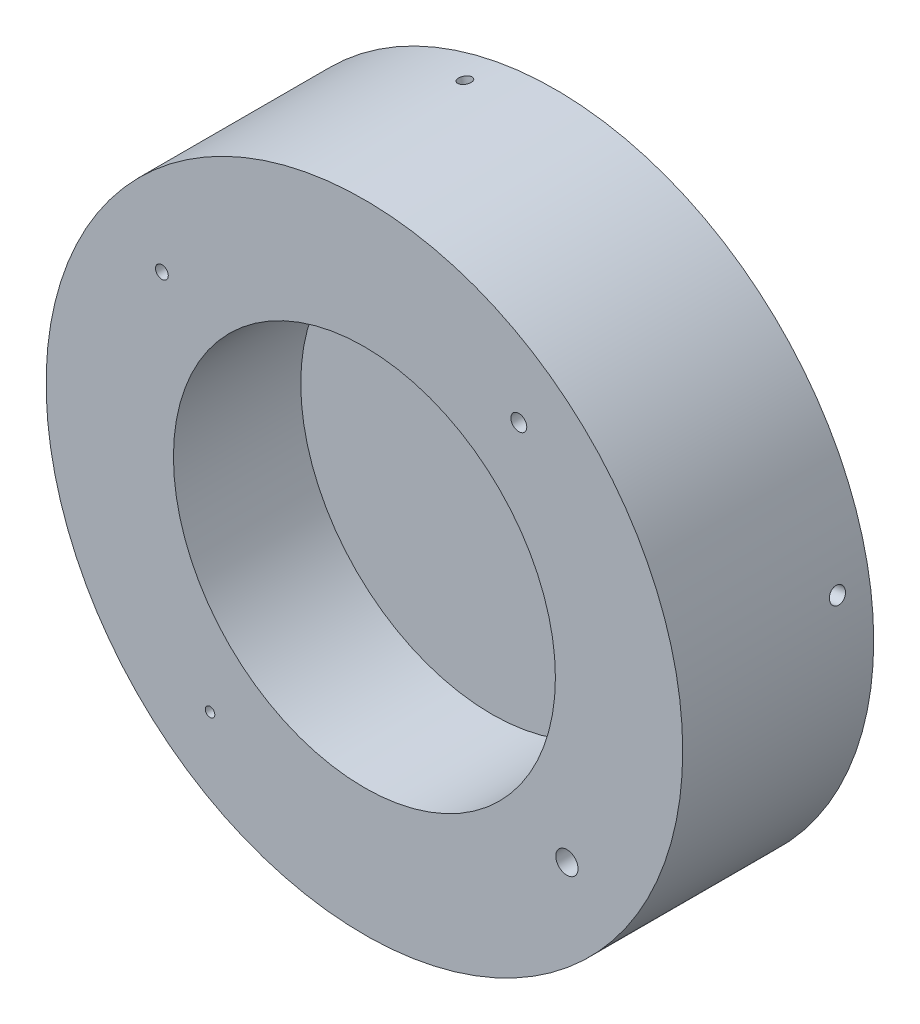
ISO-10303-21;
HEADER;
FILE_DESCRIPTION(('STEP AP214'),'2;1');
FILE_NAME('part.step','',(''),(''),'','','');
FILE_SCHEMA(('AUTOMOTIVE_DESIGN { 1 0 10303 214 1 1 1 1 }'));
ENDSEC;
DATA;
#1=APPLICATION_CONTEXT('core data for automotive mechanical design processes');
#2=APPLICATION_PROTOCOL_DEFINITION('international standard','automotive_design',2000,#1);
#3=PRODUCT_CONTEXT('',#1,'mechanical');
#4=PRODUCT('Part','Part','',(#3));
#5=PRODUCT_RELATED_PRODUCT_CATEGORY('part','',(#4));
#6=PRODUCT_DEFINITION_FORMATION('','',#4);
#7=PRODUCT_DEFINITION_CONTEXT('part definition',#1,'design');
#8=PRODUCT_DEFINITION('design','',#6,#7);
#9=PRODUCT_DEFINITION_SHAPE('','',#8);
#10=(LENGTH_UNIT() NAMED_UNIT(*) SI_UNIT(.MILLI.,.METRE.));
#11=(NAMED_UNIT(*) PLANE_ANGLE_UNIT() SI_UNIT($,.RADIAN.));
#12=(NAMED_UNIT(*) SI_UNIT($,.STERADIAN.) SOLID_ANGLE_UNIT());
#13=UNCERTAINTY_MEASURE_WITH_UNIT(LENGTH_MEASURE(1.E-05),#10,'distance_accuracy_value','');
#14=(GEOMETRIC_REPRESENTATION_CONTEXT(3) GLOBAL_UNCERTAINTY_ASSIGNED_CONTEXT((#13)) GLOBAL_UNIT_ASSIGNED_CONTEXT((#10,
#11,#12)) REPRESENTATION_CONTEXT('',''));
#15=CARTESIAN_POINT('',(0.,0.,0.));
#16=DIRECTION('',(0.,0.,1.));
#17=DIRECTION('',(1.,0.,0.));
#18=AXIS2_PLACEMENT_3D('',#15,#16,#17);
#19=CARTESIAN_POINT('',(0.,0.,30.));
#20=DIRECTION('',(0.,0.,-1.));
#21=DIRECTION('',(-1.,0.,0.));
#22=AXIS2_PLACEMENT_3D('',#19,#20,#21);
#23=CYLINDRICAL_SURFACE('',#22,50.);
#24=CARTESIAN_POINT('',(-48.800785067302,-10.8850069735848,4.99999999995523));
#25=CARTESIAN_POINT('',(-48.8007855208781,-10.8850051606418,4.95787471332662));
#26=CARTESIAN_POINT('',(-48.8015607673271,-10.8815310808378,4.91571894220845));
#27=CARTESIAN_POINT('',(-48.8046382711358,-10.8677196942154,4.83256856630695));
#28=CARTESIAN_POINT('',(-48.8069423629934,-10.8573741421391,4.79157541827735));
#29=CARTESIAN_POINT('',(-48.8129989948363,-10.8301118646555,4.71196695037527));
#30=CARTESIAN_POINT('',(-48.8167508387879,-10.8131982969187,4.6733504981908));
#31=CARTESIAN_POINT('',(-48.825575731305,-10.7732803872153,4.59958475534791));
#32=CARTESIAN_POINT('',(-48.8306484528388,-10.7502775528458,4.56443460944438));
#33=CARTESIAN_POINT('',(-48.8419480602775,-10.6988224372536,4.49858050788876));
#34=CARTESIAN_POINT('',(-48.8481751479189,-10.6703692034918,4.46787733106065));
#35=CARTESIAN_POINT('',(-48.8615799978647,-10.6088166209847,4.41179508906996));
#36=CARTESIAN_POINT('',(-48.8687577976158,-10.5757170892278,4.38641623372374));
#37=CARTESIAN_POINT('',(-48.8838349612512,-10.50580583771,4.34170378967206));
#38=CARTESIAN_POINT('',(-48.8917343456821,-10.4689940122415,4.32237037317504));
#39=CARTESIAN_POINT('',(-48.9080087271457,-10.3926994686154,4.29029885609574));
#40=CARTESIAN_POINT('',(-48.9163837229845,-10.3532167571621,4.27756073895887));
#41=CARTESIAN_POINT('',(-48.9333557298357,-10.2727011379365,4.25904227347175));
#42=CARTESIAN_POINT('',(-48.9419527242867,-10.231668345698,4.25326140762066));
#43=CARTESIAN_POINT('',(-48.9591180627002,-10.1492133516525,4.24881995878137));
#44=CARTESIAN_POINT('',(-48.9676864067301,-10.1077911507605,4.25015935906727));
#45=CARTESIAN_POINT('',(-48.9845521873617,-10.0257369654453,4.25991995347415));
#46=CARTESIAN_POINT('',(-48.9928496456195,-9.98510491795862,4.26834058003746));
#47=CARTESIAN_POINT('',(-49.0089491990742,-9.90578302613289,4.29202372344142));
#48=CARTESIAN_POINT('',(-49.0167512936062,-9.86709318440093,4.30728624946578));
#49=CARTESIAN_POINT('',(-49.0316568159556,-9.79275592948971,4.34422058812155));
#50=CARTESIAN_POINT('',(-49.0387602154048,-9.75710863985114,4.3658926608487));
#51=CARTESIAN_POINT('',(-49.0520897278021,-9.6898746074339,4.41503068905194));
#52=CARTESIAN_POINT('',(-49.0583158405152,-9.65828786574335,4.44249664608063));
#53=CARTESIAN_POINT('',(-49.0697408438508,-9.60007372994537,4.50244600260986));
#54=CARTESIAN_POINT('',(-49.0749396330971,-9.5734468252892,4.53492989671713));
#55=CARTESIAN_POINT('',(-49.0841877383956,-9.52591739629909,4.60399126698543));
#56=CARTESIAN_POINT('',(-49.0882370542895,-9.50501487275306,4.6405687437099));
#57=CARTESIAN_POINT('',(-49.0950942991049,-9.46953240378462,4.71677922697116));
#58=CARTESIAN_POINT('',(-49.0979022251557,-9.454952472983,4.75641224057352));
#59=CARTESIAN_POINT('',(-49.1022143374347,-9.43253298951759,4.83760861561692));
#60=CARTESIAN_POINT('',(-49.1037185245944,-9.4246934320384,4.87917197567887));
#61=CARTESIAN_POINT('',(-49.105390164438,-9.41597987083836,4.96304484832944));
#62=CARTESIAN_POINT('',(-49.1055577474127,-9.41510518818861,5.00535428778803));
#63=CARTESIAN_POINT('',(-49.1045528760412,-9.42034466923849,5.08952209890449));
#64=CARTESIAN_POINT('',(-49.1033804220375,-9.42645883115164,5.13138047067766));
#65=CARTESIAN_POINT('',(-49.0997211549836,-9.44550027895045,5.21345599379049));
#66=CARTESIAN_POINT('',(-49.0972344012217,-9.45842725750953,5.2536732190742));
#67=CARTESIAN_POINT('',(-49.0910015206107,-9.49072382006876,5.33132707092279));
#68=CARTESIAN_POINT('',(-49.0872553932499,-9.51009340668633,5.368763696358));
#69=CARTESIAN_POINT('',(-49.078587913254,-9.55472256207217,5.43979682571229));
#70=CARTESIAN_POINT('',(-49.073666469533,-9.57998258733975,5.47339303170433));
#71=CARTESIAN_POINT('',(-49.062762602998,-9.63566959762571,5.53578865004704));
#72=CARTESIAN_POINT('',(-49.0567801791857,-9.66609658750548,5.56458805788457));
#73=CARTESIAN_POINT('',(-49.0438971776678,-9.73125122414676,5.61657484855946));
#74=CARTESIAN_POINT('',(-49.0369965269402,-9.76597921292962,5.63976178465165));
#75=CARTESIAN_POINT('',(-49.0224490099297,-9.83874320291316,5.67986235734782));
#76=CARTESIAN_POINT('',(-49.0148021446586,-9.87677919962837,5.69677600245788));
#77=CARTESIAN_POINT('',(-48.9989601850729,-9.95507381442532,5.72384910719593));
#78=CARTESIAN_POINT('',(-48.9907651144697,-9.99533233636353,5.73400885874093));
#79=CARTESIAN_POINT('',(-48.9740467434993,-10.0769280653155,5.74728674066243));
#80=CARTESIAN_POINT('',(-48.9655234427602,-10.1182652735511,5.75040486306202));
#81=CARTESIAN_POINT('',(-48.9483875960948,-10.2008396544519,5.74951091613566));
#82=CARTESIAN_POINT('',(-48.9397750591733,-10.2420768367022,5.74549955940936));
#83=CARTESIAN_POINT('',(-48.9227093712373,-10.323285817716,5.73046196969944));
#84=CARTESIAN_POINT('',(-48.9142562205423,-10.3632576139428,5.71943572265423));
#85=CARTESIAN_POINT('',(-48.8977624319527,-10.440804660623,5.69068125544002));
#86=CARTESIAN_POINT('',(-48.8897218016386,-10.478379867039,5.67295291216116));
#87=CARTESIAN_POINT('',(-48.8743018547211,-10.5500693986484,5.6312983106878));
#88=CARTESIAN_POINT('',(-48.8669225126793,-10.5841838569761,5.60737229104275));
#89=CARTESIAN_POINT('',(-48.8530589213327,-10.6479905143952,5.55400158813901));
#90=CARTESIAN_POINT('',(-48.8465746662296,-10.6776827421329,5.52455694063163));
#91=CARTESIAN_POINT('',(-48.8347101326393,-10.7318151511759,5.46097492443131));
#92=CARTESIAN_POINT('',(-48.8293301286842,-10.7562540264967,5.42683639228811));
#93=CARTESIAN_POINT('',(-48.8198517941323,-10.7991923805374,5.3548278927136));
#94=CARTESIAN_POINT('',(-48.8157541314238,-10.8176887643334,5.31695599427263));
#95=CARTESIAN_POINT('',(-48.8089856977318,-10.8481870153032,5.23859863512402));
#96=CARTESIAN_POINT('',(-48.8063132184726,-10.8601966579385,5.19811636886462));
#97=CARTESIAN_POINT('',(-48.8031974103152,-10.8741873559878,5.13114722601548));
#98=CARTESIAN_POINT('',(-48.8022940991529,-10.8782396771539,5.10509538608473));
#99=CARTESIAN_POINT('',(-48.8010877857775,-10.8836500529913,5.0526996750378));
#100=CARTESIAN_POINT('',(-48.8007847835209,-10.8850081078577,5.02635580394276));
#101=CARTESIAN_POINT('',(-48.800785067302,-10.8850069735848,4.99999999995523));
#102=B_SPLINE_CURVE_WITH_KNOTS('',3,(#24,#25,#26,#27,#28,#29,#30,#31,#32,#33,#34,#35,#36,#37,
#38,#39,#40,#41,#42,#43,#44,#45,#46,#47,#48,#49,#50,#51,#52,#53,#54,#55,#56,#57,#58,#59,#60,#61,
#62,#63,#64,#65,#66,#67,#68,#69,#70,#71,#72,#73,#74,#75,#76,#77,#78,#79,#80,#81,#82,#83,#84,#85,
#86,#87,#88,#89,#90,#91,#92,#93,#94,#95,#96,#97,#98,#99,#100,#101),.UNSPECIFIED.,.T.,.F.,(4,2,2,
2,2,2,2,2,2,2,2,2,2,2,2,2,2,2,2,2,2,2,2,2,2,2,2,2,2,2,2,2,2,2,2,2,2,2,4),(0.,0.126279660400355,
0.252711121452311,0.379081873814959,0.505421368176357,0.631782962434159,0.758149535307918,
0.884519707491547,1.01088956247704,1.13725001711937,1.26361017493383,1.3899602059936,
1.51631040665065,1.64266573523025,1.76902109766945,1.89538892262807,2.02175676498018,
2.1481248995522,2.2744929438453,2.40084866975954,2.52720436337501,2.65355435756532,
2.77990440308767,2.90626424378678,3.03262420337304,3.15899421773629,3.28536406075132,
3.41172844144979,3.53809296529644,3.6644448595738,3.79079700712884,3.91715147574143,
4.04350108167497,4.16984986910643,4.29623003064188,4.42267590624933,4.54896987671642,
4.62797710691855,4.70698433140265),.UNSPECIFIED.);
#103=CARTESIAN_POINT('',(-48.800785067302,-10.8850069735848,4.99999999995523));
#104=VERTEX_POINT('',#103);
#105=EDGE_CURVE('E11',#104,#104,#102,.T.);
#106=ORIENTED_EDGE('',*,*,#105,.T.);
#107=EDGE_LOOP('',(#106));
#108=FACE_BOUND('',#107,.T.);
#109=CARTESIAN_POINT('',(-10.2029713928763,48.9479251322888,4.9999999999551));
#110=CARTESIAN_POINT('',(-10.202968971698,48.9479257241242,4.94383558804444));
#111=CARTESIAN_POINT('',(-10.1983229463059,48.9488947935283,4.88763059460091));
#112=CARTESIAN_POINT('',(-10.1798522783798,48.9527393835053,4.77676893596616));
#113=CARTESIAN_POINT('',(-10.166016625273,48.9556171910312,4.72211421024061));
#114=CARTESIAN_POINT('',(-10.129556764846,48.9631741657259,4.61597521063475));
#115=CARTESIAN_POINT('',(-10.1069368004873,48.9678524632197,4.56448941999636));
#116=CARTESIAN_POINT('',(-10.0535497366738,48.978841113374,4.46614016282984));
#117=CARTESIAN_POINT('',(-10.0227846466027,48.9851510635005,4.4192755601735));
#118=CARTESIAN_POINT('',(-9.95396167182417,48.9991824114361,4.3314711893695));
#119=CARTESIAN_POINT('',(-9.91590211436342,49.0069041329711,4.29053278399321));
#120=CARTESIAN_POINT('',(-9.83356410473277,49.0234920921979,4.21575418367996));
#121=CARTESIAN_POINT('',(-9.78928540693407,49.0323583750938,4.18191426923401));
#122=CARTESIAN_POINT('',(-9.69575498462024,49.0509388825895,4.122293053216));
#123=CARTESIAN_POINT('',(-9.64650293635775,49.0606531623853,4.09651227671304));
#124=CARTESIAN_POINT('',(-9.54441903736891,49.0806149861309,4.05374469861071));
#125=CARTESIAN_POINT('',(-9.49158719701891,49.0908625285351,4.03675787152253));
#126=CARTESIAN_POINT('',(-9.38384577065352,49.1115714040483,4.01206251293112));
#127=CARTESIAN_POINT('',(-9.328936463398,49.1220327083882,4.00435274113094));
#128=CARTESIAN_POINT('',(-9.21859025322034,49.1428605785652,3.99842653526415));
#129=CARTESIAN_POINT('',(-9.16315335176239,49.1532271446649,4.00021007485898));
#130=CARTESIAN_POINT('',(-9.05333444571871,49.1735727235502,4.01321878440968));
#131=CARTESIAN_POINT('',(-8.99895229166403,49.1835517914521,4.0244426064267));
#132=CARTESIAN_POINT('',(-8.89278160020703,49.2028591520459,4.05601119789246));
#133=CARTESIAN_POINT('',(-8.84099306686289,49.2121874437195,4.07635598161205));
#134=CARTESIAN_POINT('',(-8.74148145658112,49.2299609970419,4.12559052265832));
#135=CARTESIAN_POINT('',(-8.69375867409118,49.2384061947458,4.15448089819296));
#136=CARTESIAN_POINT('',(-8.60374431997916,49.254214798767,4.21998605108162));
#137=CARTESIAN_POINT('',(-8.56145275265389,49.2615782042285,4.2566008345466));
#138=CARTESIAN_POINT('',(-8.48350233839968,49.2750622192472,4.33652307966278));
#139=CARTESIAN_POINT('',(-8.44784465506514,49.2811826107949,4.37983171299214));
#140=CARTESIAN_POINT('',(-8.38419191932418,49.2920518129656,4.47190813223584));
#141=CARTESIAN_POINT('',(-8.35619686801933,49.2968006233914,4.52067591893497));
#142=CARTESIAN_POINT('',(-8.30867194309207,49.3048329711311,4.62228693184145));
#143=CARTESIAN_POINT('',(-8.28914210519589,49.3081165022611,4.67513017524758));
#144=CARTESIAN_POINT('',(-8.25910857234932,49.3131560484295,4.78339175687631));
#145=CARTESIAN_POINT('',(-8.24860486624715,49.3149120653552,4.83881009191729));
#146=CARTESIAN_POINT('',(-8.23692648182253,49.3168640322672,4.95063841909007));
#147=CARTESIAN_POINT('',(-8.23575018716477,49.3170602525488,5.00704823771087));
#148=CARTESIAN_POINT('',(-8.24275618164479,49.3158897583778,5.11926727592274));
#149=CARTESIAN_POINT('',(-8.25093846620051,49.3145230446906,5.17507649580786));
#150=CARTESIAN_POINT('',(-8.27642543208929,49.3102519490897,5.284505530219));
#151=CARTESIAN_POINT('',(-8.29372938092467,49.3073476906454,5.33812552017445));
#152=CARTESIAN_POINT('',(-8.33696248347123,49.3000561293295,5.44165937367404));
#153=CARTESIAN_POINT('',(-8.36289164428356,49.2956688252369,5.49157323416689));
#154=CARTESIAN_POINT('',(-8.42263597744996,49.2854960210921,5.58628548641292));
#155=CARTESIAN_POINT('',(-8.4564522367562,49.2797103283184,5.63108317181705));
#156=CARTESIAN_POINT('',(-8.53100067320688,49.2668595949133,5.71428433124843));
#157=CARTESIAN_POINT('',(-8.57173285974455,49.2597945525443,5.7526877965909));
#158=CARTESIAN_POINT('',(-8.65895495787904,49.2445373183464,5.82201581612398));
#159=CARTESIAN_POINT('',(-8.70544568204061,49.2363449674294,5.85293931302346));
#160=CARTESIAN_POINT('',(-8.80285279092855,49.2190230151368,5.9064223345729));
#161=CARTESIAN_POINT('',(-8.85376916862246,49.2098934152506,5.92898187251307));
#162=CARTESIAN_POINT('',(-8.95857180979106,49.1909221752164,5.96509475172836));
#163=CARTESIAN_POINT('',(-9.01245784585292,49.1810805895733,5.97864878159939));
#164=CARTESIAN_POINT('',(-9.12166934427729,49.1609421222476,5.9963681590255));
#165=CARTESIAN_POINT('',(-9.1769948075211,49.1506452402862,6.00053350083224));
#166=CARTESIAN_POINT('',(-9.28750284522874,49.1298834845414,5.99935716135633));
#167=CARTESIAN_POINT('',(-9.34268544315204,49.1194186406781,5.9940171550913));
#168=CARTESIAN_POINT('',(-9.45135281600056,49.0986251492165,5.97398512840738));
#169=CARTESIAN_POINT('',(-9.50483758753177,49.0882965018906,5.9592930892947));
#170=CARTESIAN_POINT('',(-9.60859662444722,49.0680921471649,5.92097409019677));
#171=CARTESIAN_POINT('',(-9.6588708318106,49.0582164479517,5.89734696879134));
#172=CARTESIAN_POINT('',(-9.75478626506069,49.0392346816602,5.84182963377947));
#173=CARTESIAN_POINT('',(-9.800427666378,49.0301285854415,5.8099397332225));
#174=CARTESIAN_POINT('',(-9.88579640804319,49.0129873467453,5.73879929703482));
#175=CARTESIAN_POINT('',(-9.92552333525849,49.0049522790843,5.69954824765204));
#176=CARTESIAN_POINT('',(-9.99795049297964,48.9902271463236,5.61478791904788));
#177=CARTESIAN_POINT('',(-10.0306489774967,48.9835374154557,5.56927708938091));
#178=CARTESIAN_POINT('',(-10.0881020848044,48.9717373567415,5.47327679044633));
#179=CARTESIAN_POINT('',(-10.1128523036362,48.9666279045505,5.42278458128866));
#180=CARTESIAN_POINT('',(-10.1536656455216,48.9581812616276,5.31831304899082));
#181=CARTESIAN_POINT('',(-10.169739158358,48.9548419513541,5.26433798347602));
#182=CARTESIAN_POINT('',(-10.1884747438565,48.9509451654519,5.17501689361518));
#183=CARTESIAN_POINT('',(-10.1939042405309,48.9498144049287,5.14025098596758));
#184=CARTESIAN_POINT('',(-10.2011533229246,48.9483042030808,5.07032869050999));
#185=CARTESIAN_POINT('',(-10.2029729091107,48.9479247616588,5.03517230275049));
#186=CARTESIAN_POINT('',(-10.2029713928763,48.9479251322888,4.9999999999551));
#187=B_SPLINE_CURVE_WITH_KNOTS('',3,(#109,#110,#111,#112,#113,#114,#115,#116,#117,#118,#119,
#120,#121,#122,#123,#124,#125,#126,#127,#128,#129,#130,#131,#132,#133,#134,#135,#136,#137,#138,
#139,#140,#141,#142,#143,#144,#145,#146,#147,#148,#149,#150,#151,#152,#153,#154,#155,#156,#157,
#158,#159,#160,#161,#162,#163,#164,#165,#166,#167,#168,#169,#170,#171,#172,#173,#174,#175,#176,
#177,#178,#179,#180,#181,#182,#183,#184,#185,#186),.UNSPECIFIED.,.T.,.F.,(4,2,2,2,2,2,2,2,2,2,2,
2,2,2,2,2,2,2,2,2,2,2,2,2,2,2,2,2,2,2,2,2,2,2,2,2,2,2,4),(0.,0.16836485484515,0.336931801186656,
0.505417428086797,0.673861528641839,0.842344302796079,1.01083373315446,1.17933413865244,
1.34783405575771,1.51631144274349,1.68478836230001,1.85324122981785,2.02169436090168,
2.19015968125803,2.35862513489178,2.52712010984762,2.69561510902589,2.86411081930632,
3.03260632141014,3.20107262450354,3.36953884511402,3.53799153942948,3.70644437243262,
3.87492043431732,4.04339672502871,4.21189681591203,4.38039663905028,4.54888357655861,
4.7173706172252,4.88582797030756,5.05428566012073,5.22274639341675,5.39120074522373,
5.55966685823847,5.72817477295641,5.89677589374976,6.06517467545122,6.17061120044885,
6.27604771181367),.UNSPECIFIED.);
#188=CARTESIAN_POINT('',(-10.2029713928763,48.9479251322888,4.9999999999551));
#189=VERTEX_POINT('',#188);
#190=EDGE_CURVE('E54',#189,#189,#187,.T.);
#191=ORIENTED_EDGE('',*,*,#190,.T.);
#192=EDGE_LOOP('',(#191));
#193=FACE_BOUND('',#192,.T.);
#194=CARTESIAN_POINT('',(49.0782462253785,9.55645056708384,4.99999999995518));
#195=CARTESIAN_POINT('',(49.0782469512766,9.55644753610903,4.92979872321607));
#196=CARTESIAN_POINT('',(49.0793817612504,9.55062460486378,4.85954682315261));
#197=CARTESIAN_POINT('',(49.083880798065,9.52747497934191,4.72097860448703));
#198=CARTESIAN_POINT('',(49.0872476941851,9.51013451157093,4.65266470560018));
#199=CARTESIAN_POINT('',(49.0960787105702,9.46443837163621,4.51999999564803));
#200=CARTESIAN_POINT('',(49.1015418122521,9.43608804927333,4.45564727737175));
#201=CARTESIAN_POINT('',(49.1143534100853,9.36917519478299,4.33271884943518));
#202=CARTESIAN_POINT('',(49.1217014433584,9.33061516975259,4.27414172635807));
#203=CARTESIAN_POINT('',(49.1380090089761,9.24434921298819,4.16438802860465));
#204=CARTESIAN_POINT('',(49.1469690239253,9.19664054199498,4.11321367851515));
#205=CARTESIAN_POINT('',(49.1661712912432,9.09342346484796,4.01973676873139));
#206=CARTESIAN_POINT('',(49.1764135944315,9.03791474955155,3.97743456083637));
#207=CARTESIAN_POINT('',(49.1978197127936,8.92065482640533,3.90290060917226));
#208=CARTESIAN_POINT('',(49.2089836313119,8.85890291830517,3.87066999671787));
#209=CARTESIAN_POINT('',(49.2318548486568,8.73090433935689,3.81720159455826));
#210=CARTESIAN_POINT('',(49.2435621456368,8.66465768378268,3.79596376749983));
#211=CARTESIAN_POINT('',(49.2671426533773,8.52955762261599,3.76508802509969));
#212=CARTESIAN_POINT('',(49.2790158287866,8.46070476725554,3.75544767518364));
#213=CARTESIAN_POINT('',(49.3025732353075,8.32233123932281,3.74803304908294));
#214=CARTESIAN_POINT('',(49.3142574670465,8.25281056896922,3.75025873348922));
#215=CARTESIAN_POINT('',(49.3371072879781,8.11509192251391,3.76651091793777));
#216=CARTESIAN_POINT('',(49.3482729923847,8.04689365456189,3.78053478312004));
#217=CARTESIAN_POINT('',(49.3698005533086,7.91374403406738,3.81998117112787));
#218=CARTESIAN_POINT('',(49.3801624083388,7.84879268753107,3.84540371503795));
#219=CARTESIAN_POINT('',(49.3998392538223,7.72398072071508,3.90692882621285));
#220=CARTESIAN_POINT('',(49.409154125683,7.66412067731752,3.94303260166979));
#221=CARTESIAN_POINT('',(49.4265366734057,7.551207918197,4.02489440814721));
#222=CARTESIAN_POINT('',(49.4346043474423,7.49815521243757,4.07065245329786));
#223=CARTESIAN_POINT('',(49.4493389234625,7.400360257231,4.17053881545105));
#224=CARTESIAN_POINT('',(49.4560054414088,7.35562028657703,4.22466942021635));
#225=CARTESIAN_POINT('',(49.4678186987676,7.27575071850909,4.33975624573179));
#226=CARTESIAN_POINT('',(49.4729654379483,7.24062112256102,4.40071246752304));
#227=CARTESIAN_POINT('',(49.4816575049767,7.18098066862699,4.52772146576869));
#228=CARTESIAN_POINT('',(49.485202821981,7.15646988254182,4.59377427672892));
#229=CARTESIAN_POINT('',(49.4906399589968,7.11877252528431,4.72910085356436));
#230=CARTESIAN_POINT('',(49.4925317821599,7.10558593252714,4.79837461329992));
#231=CARTESIAN_POINT('',(49.4946353418801,7.09091873435125,4.93815654148753));
#232=CARTESIAN_POINT('',(49.494847533196,7.08943496040593,5.00866437063471));
#233=CARTESIAN_POINT('',(49.4935901402024,7.09820779613848,5.14893060545555));
#234=CARTESIAN_POINT('',(49.4921205572225,7.10846439653397,5.21868901172169));
#235=CARTESIAN_POINT('',(49.4875201637028,7.14042056886678,5.35546727464041));
#236=CARTESIAN_POINT('',(49.4843895618639,7.16211870321478,5.4224874741996));
#237=CARTESIAN_POINT('',(49.4765124259181,7.21633315263405,5.55189736557809));
#238=CARTESIAN_POINT('',(49.4717658896157,7.24884948240419,5.6142870511057));
#239=CARTESIAN_POINT('',(49.4607293357698,7.32377514313243,5.73267962511512));
#240=CARTESIAN_POINT('',(49.4544389858653,7.3661866042736,5.78868113450619));
#241=CARTESIAN_POINT('',(49.4404222496839,7.45968339399416,5.89269382189824));
#242=CARTESIAN_POINT('',(49.4326958606853,7.51076873901321,5.94070498475475));
#243=CARTESIAN_POINT('',(49.4159504010064,7.62016422060733,6.02738476642718));
#244=CARTESIAN_POINT('',(49.4069310454545,7.6784759489433,6.06605132134613));
#245=CARTESIAN_POINT('',(49.3877888709755,7.80064924067405,6.13293015341769));
#246=CARTESIAN_POINT('',(49.3776660541317,7.86451079359042,6.16114245030807));
#247=CARTESIAN_POINT('',(49.3565511896652,7.99595405633272,6.20630831100857));
#248=CARTESIAN_POINT('',(49.3455592457249,8.06353532212472,6.22326321550643));
#249=CARTESIAN_POINT('',(49.3229825932145,8.20050019731635,6.24543740478271));
#250=CARTESIAN_POINT('',(49.3113978846783,8.26988380661295,6.25065669023204));
#251=CARTESIAN_POINT('',(49.287957066937,8.40846152875126,6.24921131622653));
#252=CARTESIAN_POINT('',(49.276101033034,8.47765568834342,6.24254991551869));
#253=CARTESIAN_POINT('',(49.2524649768328,8.61391182430826,6.21753894910861));
#254=CARTESIAN_POINT('',(49.240684954686,8.68097379643601,6.19918936013809));
#255=CARTESIAN_POINT('',(49.2175722528579,8.81106975637065,6.1513232089386));
#256=CARTESIAN_POINT('',(49.2062395810282,8.87410367349237,6.12180645080868));
#257=CARTESIAN_POINT('',(49.1843999310115,8.99436174506507,6.0524453474972));
#258=CARTESIAN_POINT('',(49.1738929222014,9.05158611500936,6.01260138557719));
#259=CARTESIAN_POINT('',(49.1540693667608,9.1586261875002,5.92370879208294));
#260=CARTESIAN_POINT('',(49.144753020253,9.20844064484104,5.87465861656723));
#261=CARTESIAN_POINT('',(49.12764894397,9.29926078418266,5.76873344385662));
#262=CARTESIAN_POINT('',(49.1198615937093,9.34026427943811,5.71185650991282));
#263=CARTESIAN_POINT('',(49.1061062342619,9.41231539015042,5.5918738840381));
#264=CARTESIAN_POINT('',(49.1001393120221,9.44335705813914,5.52876450046446));
#265=CARTESIAN_POINT('',(49.0902657462555,9.49455081248533,5.3981830406399));
#266=CARTESIAN_POINT('',(49.0863566420335,9.5147159055344,5.33071628377516));
#267=CARTESIAN_POINT('',(49.0817898489539,9.53823799556457,5.21901848639641));
#268=CARTESIAN_POINT('',(49.0804631829487,9.54505922633214,5.1755126975706));
#269=CARTESIAN_POINT('',(49.0786911436848,9.55416646182775,5.08801123939081));
#270=CARTESIAN_POINT('',(49.078245770247,9.55645246747783,5.04401557013644));
#271=CARTESIAN_POINT('',(49.0782462253785,9.55645056708384,4.99999999995518));
#272=B_SPLINE_CURVE_WITH_KNOTS('',3,(#194,#195,#196,#197,#198,#199,#200,#201,#202,#203,#204,
#205,#206,#207,#208,#209,#210,#211,#212,#213,#214,#215,#216,#217,#218,#219,#220,#221,#222,#223,
#224,#225,#226,#227,#228,#229,#230,#231,#232,#233,#234,#235,#236,#237,#238,#239,#240,#241,#242,
#243,#244,#245,#246,#247,#248,#249,#250,#251,#252,#253,#254,#255,#256,#257,#258,#259,#260,#261,
#262,#263,#264,#265,#266,#267,#268,#269,#270,#271),.UNSPECIFIED.,.T.,.F.,(4,2,2,2,2,2,2,2,2,2,2,
2,2,2,2,2,2,2,2,2,2,2,2,2,2,2,2,2,2,2,2,2,2,2,2,2,2,2,4),(0.,0.210443169422808,
0.421138456051026,0.631731491527136,0.842272861609964,1.05287737004646,1.26349022781997,
1.47412673466133,1.68476252576042,1.89535409189402,2.10594495861813,2.3164888070592,
2.52703304495179,2.73760110736393,2.94816947796974,3.15879548737541,3.36942152890815,
3.58004899658386,3.79067606278584,4.0012460999602,4.21181597065017,4.42235939026338,
4.63290309594668,4.8434921684997,5.05408164018753,5.26471758130194,5.47535312473107,
5.68596357823184,5.89657401969204,6.10712670181191,6.31767980309148,6.52823659818708,
6.73878558025121,6.9493699043416,7.16000643201453,7.3707684821873,7.58127793177575,
7.71322393626978,7.84516991393795),.UNSPECIFIED.);
#273=CARTESIAN_POINT('',(49.0782462253785,9.55645056708384,4.99999999995518));
#274=VERTEX_POINT('',#273);
#275=EDGE_CURVE('E124',#274,#274,#272,.T.);
#276=ORIENTED_EDGE('',*,*,#275,.T.);
#277=EDGE_LOOP('',(#276));
#278=FACE_BOUND('',#277,.T.);
#279=CARTESIAN_POINT('',(11.4745432703628,-48.6655407525343,4.9999999999554));
#280=CARTESIAN_POINT('',(11.4745390869464,-48.6655420066177,4.90173403671707));
#281=CARTESIAN_POINT('',(11.4664558464455,-48.6674498339534,4.80339758761567));
#282=CARTESIAN_POINT('',(11.4343188724375,-48.6750101582917,4.60943514262716));
#283=CARTESIAN_POINT('',(11.4102461147698,-48.6806671159527,4.51381251710481));
#284=CARTESIAN_POINT('',(11.3468041467567,-48.6954935364374,4.32811567515766));
#285=CARTESIAN_POINT('',(11.3074424834565,-48.7046612662112,4.23803874659279));
#286=CARTESIAN_POINT('',(11.2145295539845,-48.7261386666198,4.06596935560867));
#287=CARTESIAN_POINT('',(11.1609817283767,-48.7384475753994,3.98397493954812));
#288=CARTESIAN_POINT('',(11.0411548254475,-48.7657325013298,3.83032636415359));
#289=CARTESIAN_POINT('',(10.9748695561564,-48.780709815396,3.75867726371055));
#290=CARTESIAN_POINT('',(10.8314319214853,-48.8127593097188,3.62779593699564));
#291=CARTESIAN_POINT('',(10.7542791213726,-48.8298315737759,3.5685642076905));
#292=CARTESIAN_POINT('',(10.5912478377404,-48.8654522368213,3.46418892829636));
#293=CARTESIAN_POINT('',(10.5053672807749,-48.8840009863492,3.419048736342));
#294=CARTESIAN_POINT('',(10.3273094453686,-48.9219271592697,3.34415962621076));
#295=CARTESIAN_POINT('',(10.2351321967193,-48.9413045787415,3.31441063521885));
#296=CARTESIAN_POINT('',(10.0471213639137,-48.980246626843,3.27116015631276));
#297=CARTESIAN_POINT('',(9.95128930617673,-48.9998111748158,3.25765196051499));
#298=CARTESIAN_POINT('',(9.75864787126689,-49.0385403844657,3.24724584281229));
#299=CARTESIAN_POINT('',(9.66183849876596,-49.0577050480531,3.25034784154161));
#300=CARTESIAN_POINT('',(9.47003689605704,-49.095090856477,3.27306842830767));
#301=CARTESIAN_POINT('',(9.37504388863424,-49.1133124108331,3.29267978263905));
#302=CARTESIAN_POINT('',(9.18953755933743,-49.1483602579283,3.34785118911211));
#303=CARTESIAN_POINT('',(9.09902424913754,-49.1651865470312,3.38341128281392));
#304=CARTESIAN_POINT('',(8.92504305023979,-49.1970673819633,3.46947903612968));
#305=CARTESIAN_POINT('',(8.84157672750884,-49.2121215342835,3.51999000691903));
#306=CARTESIAN_POINT('',(8.68410141087464,-49.2401542433477,3.63452324508995));
#307=CARTESIAN_POINT('',(8.61009244776786,-49.2531327933329,3.69854555646739));
#308=CARTESIAN_POINT('',(8.47361950286394,-49.2767955837941,3.83832505044816));
#309=CARTESIAN_POINT('',(8.41116173479623,-49.2874785899266,3.91408850892177));
#310=CARTESIAN_POINT('',(8.29964047796909,-49.3063806986499,4.07517753261245));
#311=CARTESIAN_POINT('',(8.25057699163335,-49.3145998007949,4.16050309955976));
#312=CARTESIAN_POINT('',(8.16726274644868,-49.3284665461862,4.33829787328452));
#313=CARTESIAN_POINT('',(8.13301219661722,-49.3341141531473,4.43076718084178));
#314=CARTESIAN_POINT('',(8.08031908924146,-49.3427721405987,4.62022292826528));
#315=CARTESIAN_POINT('',(8.06187647324475,-49.3457825308405,4.71720935142733));
#316=CARTESIAN_POINT('',(8.04134114961794,-49.3491331547619,4.91289110395218));
#317=CARTESIAN_POINT('',(8.03923977148501,-49.3494748044499,5.01158549921601));
#318=CARTESIAN_POINT('',(8.05142521312574,-49.34748816994,5.20793004392365));
#319=CARTESIAN_POINT('',(8.06571200677085,-49.3451598899989,5.30558019503209));
#320=CARTESIAN_POINT('',(8.11025271080267,-49.3378587376174,5.49703978297503));
#321=CARTESIAN_POINT('',(8.14050267689531,-49.332886518458,5.5908501624003));
#322=CARTESIAN_POINT('',(8.21609006727916,-49.3203540457204,5.77199623069947));
#323=CARTESIAN_POINT('',(8.26142753354775,-49.3127937849417,5.85933190155821));
#324=CARTESIAN_POINT('',(8.36590157774874,-49.2951771231758,6.02508984251779));
#325=CARTESIAN_POINT('',(8.42504397258927,-49.2851196698459,6.10350833446304));
#326=CARTESIAN_POINT('',(8.55541269809959,-49.2626560090739,6.24916794046372));
#327=CARTESIAN_POINT('',(8.62663906901345,-49.2502497938096,6.3164090172928));
#328=CARTESIAN_POINT('',(8.77916227287444,-49.223290203684,6.43783440725943));
#329=CARTESIAN_POINT('',(8.86046345094914,-49.2087359018616,6.49201305686914));
#330=CARTESIAN_POINT('',(9.03077968213553,-49.1777642856956,6.58573694319709));
#331=CARTESIAN_POINT('',(9.11979471455809,-49.1613469763487,6.62528221916161));
#332=CARTESIAN_POINT('',(9.30296978801291,-49.1270132098229,6.68860688057997));
#333=CARTESIAN_POINT('',(9.39712862929274,-49.1090971017133,6.71238992559773));
#334=CARTESIAN_POINT('',(9.58792237528612,-49.072203757228,6.743527008401));
#335=CARTESIAN_POINT('',(9.68455727543567,-49.0532265228083,6.75088107646706));
#336=CARTESIAN_POINT('',(9.87750035383392,-49.0147392015379,6.74895103859824));
#337=CARTESIAN_POINT('',(9.97380867938089,-48.9952294055949,6.73967584400102));
#338=CARTESIAN_POINT('',(10.1634220889077,-48.9562480563868,6.70476892324208));
#339=CARTESIAN_POINT('',(10.2567271669886,-48.9367765031969,6.67913716495503));
#340=CARTESIAN_POINT('',(10.4377026808809,-48.8984961405273,6.61224615817645));
#341=CARTESIAN_POINT('',(10.5253730298238,-48.879687341267,6.57098666882563));
#342=CARTESIAN_POINT('',(10.6926120612957,-48.843375999367,6.47401385214565));
#343=CARTESIAN_POINT('',(10.7721810276501,-48.8258734109709,6.41830103141976));
#344=CARTESIAN_POINT('',(10.9210268207641,-48.79279659255,6.29397444840867));
#345=CARTESIAN_POINT('',(10.9902992178096,-48.7772231929638,6.22535516219256));
#346=CARTESIAN_POINT('',(11.1165927418299,-48.7485955828458,6.07715427436319));
#347=CARTESIAN_POINT('',(11.173610834971,-48.7355419962326,5.99756996609206));
#348=CARTESIAN_POINT('',(11.2738177586622,-48.7124592636586,5.82966066273736));
#349=CARTESIAN_POINT('',(11.3169967284121,-48.7024322745362,5.74132949364734));
#350=CARTESIAN_POINT('',(11.388225859717,-48.685826089973,5.55854519495644));
#351=CARTESIAN_POINT('',(11.4162940273702,-48.6792427912822,5.46409950253085));
#352=CARTESIAN_POINT('',(11.4490983873212,-48.6715348305566,5.30754930898803));
#353=CARTESIAN_POINT('',(11.4586283828914,-48.6692909237474,5.24646053071671));
#354=CARTESIAN_POINT('',(11.4713521388103,-48.6662934906297,5.12359046375935));
#355=CARTESIAN_POINT('',(11.4745459017267,-48.6655399637173,5.06180917535395));
#356=CARTESIAN_POINT('',(11.4745432703628,-48.6655407525343,4.9999999999554));
#357=B_SPLINE_CURVE_WITH_KNOTS('',3,(#279,#280,#281,#282,#283,#284,#285,#286,#287,#288,#289,
#290,#291,#292,#293,#294,#295,#296,#297,#298,#299,#300,#301,#302,#303,#304,#305,#306,#307,#308,
#309,#310,#311,#312,#313,#314,#315,#316,#317,#318,#319,#320,#321,#322,#323,#324,#325,#326,#327,
#328,#329,#330,#331,#332,#333,#334,#335,#336,#337,#338,#339,#340,#341,#342,#343,#344,#345,#346,
#347,#348,#349,#350,#351,#352,#353,#354,#355,#356),.UNSPECIFIED.,.T.,.F.,(4,2,2,2,2,2,2,2,2,2,2,
2,2,2,2,2,2,2,2,2,2,2,2,2,2,2,2,2,2,2,2,2,2,2,2,2,2,2,4),(0.,0.294572274989093,
0.589495658304697,0.884273643560637,1.1789802017822,1.47383038785599,1.76869237214152,
2.06362457102876,2.35855537459315,2.65336432193953,2.94817186065012,3.24285029428631,
3.53752949581654,3.83227400893458,4.12701948181965,4.42192304875267,4.7168266690481,
5.01173445043568,5.30664114134882,5.60139134693934,5.89614108259457,6.19081802346786,
6.48549578421623,6.78029793660163,7.07510107080545,7.37003179502327,7.66496172823972,
7.95982316268829,8.25468405367159,8.54938698096861,8.84409048708258,9.13879853544043,
9.43349625539094,9.7283203933362,10.0232174378872,10.3183241408944,10.6130784107124,
10.798364100595,10.9836497153932),.UNSPECIFIED.);
#358=CARTESIAN_POINT('',(11.4745432703628,-48.6655407525343,4.9999999999554));
#359=VERTEX_POINT('',#358);
#360=EDGE_CURVE('E113',#359,#359,#357,.T.);
#361=ORIENTED_EDGE('',*,*,#360,.T.);
#362=EDGE_LOOP('',(#361));
#363=FACE_BOUND('',#362,.T.);
#364=CARTESIAN_POINT('',(0.,0.,30.));
#365=DIRECTION('',(0.,0.,1.));
#366=DIRECTION('',(1.,0.,0.));
#367=AXIS2_PLACEMENT_3D('',#364,#365,#366);
#368=CIRCLE('',#367,50.);
#369=CARTESIAN_POINT('',(50.,0.,30.));
#370=VERTEX_POINT('',#369);
#371=EDGE_CURVE('E109',#370,#370,#368,.T.);
#372=ORIENTED_EDGE('',*,*,#371,.F.);
#373=EDGE_LOOP('',(#372));
#374=FACE_BOUND('',#373,.T.);
#375=CARTESIAN_POINT('',(0.,0.,0.));
#376=DIRECTION('',(0.,0.,1.));
#377=DIRECTION('',(1.,0.,0.));
#378=AXIS2_PLACEMENT_3D('',#375,#376,#377);
#379=CIRCLE('',#378,50.);
#380=CARTESIAN_POINT('',(50.,0.,0.));
#381=VERTEX_POINT('',#380);
#382=EDGE_CURVE('E105',#381,#381,#379,.T.);
#383=ORIENTED_EDGE('',*,*,#382,.T.);
#384=EDGE_LOOP('',(#383));
#385=FACE_BOUND('',#384,.T.);
#386=ADVANCED_FACE('F41',(#108,#193,#278,#363,#374,#385),#23,.T.);
#387=CARTESIAN_POINT('',(0.,0.,30.));
#388=DIRECTION('',(0.,0.,1.));
#389=DIRECTION('',(1.,0.,0.));
#390=AXIS2_PLACEMENT_3D('',#387,#388,#389);
#391=PLANE('',#390);
#392=CARTESIAN_POINT('',(-24.2507433330899,-31.8103984224121,30.));
#393=DIRECTION('',(0.,0.,1.));
#394=DIRECTION('',(1.,0.,0.));
#395=AXIS2_PLACEMENT_3D('',#392,#393,#394);
#396=CIRCLE('',#395,0.749999999999997);
#397=CARTESIAN_POINT('',(-23.5007433330899,-31.8103984224121,30.));
#398=VERTEX_POINT('',#397);
#399=EDGE_CURVE('E354',#398,#398,#396,.T.);
#400=ORIENTED_EDGE('',*,*,#399,.F.);
#401=EDGE_LOOP('',(#400));
#402=FACE_BOUND('',#401,.T.);
#403=CARTESIAN_POINT('',(-31.8091487090589,24.252382530485,30.));
#404=DIRECTION('',(0.,0.,1.));
#405=DIRECTION('',(1.,0.,0.));
#406=AXIS2_PLACEMENT_3D('',#403,#404,#405);
#407=CIRCLE('',#406,0.999999999999997);
#408=CARTESIAN_POINT('',(-30.8091487090589,24.252382530485,30.));
#409=VERTEX_POINT('',#408);
#410=EDGE_CURVE('E359',#409,#409,#407,.T.);
#411=ORIENTED_EDGE('',*,*,#410,.F.);
#412=EDGE_LOOP('',(#411));
#413=FACE_BOUND('',#412,.T.);
#414=CARTESIAN_POINT('',(24.2540216634787,31.8078989112375,30.));
#415=DIRECTION('',(0.,0.,1.));
#416=DIRECTION('',(1.,0.,0.));
#417=AXIS2_PLACEMENT_3D('',#414,#415,#416);
#418=CIRCLE('',#417,1.25);
#419=CARTESIAN_POINT('',(25.5040216634787,31.8078989112375,30.));
#420=VERTEX_POINT('',#419);
#421=EDGE_CURVE('E369',#420,#420,#418,.T.);
#422=ORIENTED_EDGE('',*,*,#421,.F.);
#423=EDGE_LOOP('',(#422));
#424=FACE_BOUND('',#423,.T.);
#425=CARTESIAN_POINT('',(31.8066490289512,-24.2556607320666,30.));
#426=DIRECTION('',(0.,0.,1.));
#427=DIRECTION('',(1.,0.,0.));
#428=AXIS2_PLACEMENT_3D('',#425,#426,#427);
#429=CIRCLE('',#428,1.74999999999999);
#430=CARTESIAN_POINT('',(33.5566490289512,-24.2556607320666,30.));
#431=VERTEX_POINT('',#430);
#432=EDGE_CURVE('E89',#431,#431,#429,.T.);
#433=ORIENTED_EDGE('',*,*,#432,.F.);
#434=EDGE_LOOP('',(#433));
#435=FACE_BOUND('',#434,.T.);
#436=CARTESIAN_POINT('',(0.,0.,30.));
#437=DIRECTION('',(0.,0.,1.));
#438=DIRECTION('',(1.,0.,0.));
#439=AXIS2_PLACEMENT_3D('',#436,#437,#438);
#440=CIRCLE('',#439,30.);
#441=CARTESIAN_POINT('',(30.,0.,30.));
#442=VERTEX_POINT('',#441);
#443=EDGE_CURVE('E100',#442,#442,#440,.T.);
#444=ORIENTED_EDGE('',*,*,#443,.F.);
#445=EDGE_LOOP('',(#444));
#446=FACE_BOUND('',#445,.T.);
#447=ORIENTED_EDGE('',*,*,#371,.T.);
#448=EDGE_LOOP('',(#447));
#449=FACE_BOUND('',#448,.T.);
#450=ADVANCED_FACE('F149',(#402,#413,#424,#435,#446,#449),#391,.T.);
#451=CARTESIAN_POINT('',(0.,0.,0.));
#452=DIRECTION('',(0.,0.,1.));
#453=DIRECTION('',(1.,0.,0.));
#454=AXIS2_PLACEMENT_3D('',#451,#452,#453);
#455=PLANE('',#454);
#456=CARTESIAN_POINT('',(-24.2507433330899,-31.8103984224121,0.));
#457=DIRECTION('',(0.,0.,1.));
#458=DIRECTION('',(1.,0.,0.));
#459=AXIS2_PLACEMENT_3D('',#456,#457,#458);
#460=CIRCLE('',#459,0.749999999999994);
#461=CARTESIAN_POINT('',(-23.5007433330899,-31.8103984224121,0.));
#462=VERTEX_POINT('',#461);
#463=EDGE_CURVE('E351',#462,#462,#460,.T.);
#464=ORIENTED_EDGE('',*,*,#463,.T.);
#465=EDGE_LOOP('',(#464));
#466=FACE_BOUND('',#465,.T.);
#467=CARTESIAN_POINT('',(-31.8091487090589,24.252382530485,0.));
#468=DIRECTION('',(0.,0.,1.));
#469=DIRECTION('',(1.,0.,0.));
#470=AXIS2_PLACEMENT_3D('',#467,#468,#469);
#471=CIRCLE('',#470,0.999999999999994);
#472=CARTESIAN_POINT('',(-30.8091487090589,24.252382530485,0.));
#473=VERTEX_POINT('',#472);
#474=EDGE_CURVE('E365',#473,#473,#471,.T.);
#475=ORIENTED_EDGE('',*,*,#474,.T.);
#476=EDGE_LOOP('',(#475));
#477=FACE_BOUND('',#476,.T.);
#478=CARTESIAN_POINT('',(24.2540216634787,31.8078989112375,0.));
#479=DIRECTION('',(0.,0.,1.));
#480=DIRECTION('',(1.,0.,0.));
#481=AXIS2_PLACEMENT_3D('',#478,#479,#480);
#482=CIRCLE('',#481,1.24999999999999);
#483=CARTESIAN_POINT('',(25.5040216634787,31.8078989112375,0.));
#484=VERTEX_POINT('',#483);
#485=EDGE_CURVE('E373',#484,#484,#482,.T.);
#486=ORIENTED_EDGE('',*,*,#485,.T.);
#487=EDGE_LOOP('',(#486));
#488=FACE_BOUND('',#487,.T.);
#489=CARTESIAN_POINT('',(31.8066490289512,-24.2556607320666,0.));
#490=DIRECTION('',(0.,0.,1.));
#491=DIRECTION('',(1.,0.,0.));
#492=AXIS2_PLACEMENT_3D('',#489,#490,#491);
#493=CIRCLE('',#492,1.74999999999999);
#494=CARTESIAN_POINT('',(33.5566490289512,-24.2556607320666,0.));
#495=VERTEX_POINT('',#494);
#496=EDGE_CURVE('E79',#495,#495,#493,.T.);
#497=ORIENTED_EDGE('',*,*,#496,.T.);
#498=EDGE_LOOP('',(#497));
#499=FACE_BOUND('',#498,.T.);
#500=ORIENTED_EDGE('',*,*,#382,.F.);
#501=EDGE_LOOP('',(#500));
#502=FACE_BOUND('',#501,.T.);
#503=ADVANCED_FACE('F147',(#466,#477,#488,#499,#502),#455,.F.);
#504=CARTESIAN_POINT('',(0.,0.,10.));
#505=DIRECTION('',(0.,0.,1.));
#506=DIRECTION('',(1.,0.,0.));
#507=AXIS2_PLACEMENT_3D('',#504,#505,#506);
#508=CYLINDRICAL_SURFACE('',#507,30.);
#509=CARTESIAN_POINT('',(0.,0.,10.));
#510=DIRECTION('',(0.,0.,1.));
#511=DIRECTION('',(1.,0.,0.));
#512=AXIS2_PLACEMENT_3D('',#509,#510,#511);
#513=CIRCLE('',#512,30.);
#514=CARTESIAN_POINT('',(30.,0.,10.));
#515=VERTEX_POINT('',#514);
#516=EDGE_CURVE('E101',#515,#515,#513,.T.);
#517=ORIENTED_EDGE('',*,*,#516,.F.);
#518=EDGE_LOOP('',(#517));
#519=FACE_BOUND('',#518,.T.);
#520=ORIENTED_EDGE('',*,*,#443,.T.);
#521=EDGE_LOOP('',(#520));
#522=FACE_BOUND('',#521,.T.);
#523=ADVANCED_FACE('F143',(#519,#522),#508,.F.);
#524=CARTESIAN_POINT('',(0.,0.,10.));
#525=DIRECTION('',(0.,0.,1.));
#526=DIRECTION('',(1.,0.,0.));
#527=AXIS2_PLACEMENT_3D('',#524,#525,#526);
#528=PLANE('',#527);
#529=ORIENTED_EDGE('',*,*,#516,.T.);
#530=EDGE_LOOP('',(#529));
#531=FACE_BOUND('',#530,.T.);
#532=ADVANCED_FACE('F135',(#531),#528,.T.);
#533=CARTESIAN_POINT('',(9.76421903257832,-49.0373329890996,4.9999999999554));
#534=DIRECTION('',(0.195284380651567,-0.980746659781992,0.));
#535=DIRECTION('',(0.980746659781992,0.195284380651567,0.));
#536=AXIS2_PLACEMENT_3D('',#533,#534,#535);
#537=CYLINDRICAL_SURFACE('',#536,1.74999999999999);
#538=CARTESIAN_POINT('',(1.95284380651565,-9.80746659781989,4.9999999999554));
#539=DIRECTION('',(0.195284380651567,-0.980746659781992,0.));
#540=DIRECTION('',(0.980746659781992,0.195284380651567,0.));
#541=AXIS2_PLACEMENT_3D('',#538,#539,#540);
#542=CIRCLE('',#541,1.74999999999999);
#543=CARTESIAN_POINT('',(3.66915046113413,-9.46571893167965,4.9999999999554));
#544=VERTEX_POINT('',#543);
#545=EDGE_CURVE('E96',#544,#544,#542,.T.);
#546=ORIENTED_EDGE('',*,*,#545,.F.);
#547=EDGE_LOOP('',(#546));
#548=FACE_BOUND('',#547,.T.);
#549=ORIENTED_EDGE('',*,*,#360,.F.);
#550=EDGE_LOOP('',(#549));
#551=FACE_BOUND('',#550,.T.);
#552=ADVANCED_FACE('F129',(#548,#551),#537,.F.);
#553=CARTESIAN_POINT('',(1.95284380651565,-9.80746659781989,4.9999999999554));
#554=DIRECTION('',(0.195284380651567,-0.980746659781992,0.));
#555=DIRECTION('',(0.980746659781992,0.195284380651567,0.));
#556=AXIS2_PLACEMENT_3D('',#553,#554,#555);
#557=CONICAL_SURFACE('',#556,1.74999999999999,1.02974425867665);
#558=CARTESIAN_POINT('',(1.7475010922874,-8.77620551888472,4.99999999995539));
#559=VERTEX_POINT('',#558);
#560=VERTEX_LOOP('',#559);
#561=FACE_BOUND('',#560,.T.);
#562=ORIENTED_EDGE('',*,*,#545,.T.);
#563=EDGE_LOOP('',(#562));
#564=FACE_BOUND('',#563,.T.);
#565=ADVANCED_FACE('F134',(#561,#564),#557,.F.);
#566=CARTESIAN_POINT('',(49.3018181404623,8.32650755387773,4.99999999995518));
#567=DIRECTION('',(0.986036362809246,0.166530151077555,0.));
#568=DIRECTION('',(-0.166530151077555,0.986036362809246,0.));
#569=AXIS2_PLACEMENT_3D('',#566,#567,#568);
#570=CYLINDRICAL_SURFACE('',#569,1.24999999999999);
#571=CARTESIAN_POINT('',(9.86036362809246,1.66530151077555,4.99999999995518));
#572=DIRECTION('',(0.986036362809246,0.166530151077555,0.));
#573=DIRECTION('',(-0.166530151077555,0.986036362809246,0.));
#574=AXIS2_PLACEMENT_3D('',#571,#572,#573);
#575=CIRCLE('',#574,1.24999999999999);
#576=CARTESIAN_POINT('',(9.65220093924552,2.8978469642871,4.99999999995518));
#577=VERTEX_POINT('',#576);
#578=EDGE_CURVE('E86',#577,#577,#575,.T.);
#579=ORIENTED_EDGE('',*,*,#578,.F.);
#580=EDGE_LOOP('',(#579));
#581=FACE_BOUND('',#580,.T.);
#582=ORIENTED_EDGE('',*,*,#275,.F.);
#583=EDGE_LOOP('',(#582));
#584=FACE_BOUND('',#583,.T.);
#585=ADVANCED_FACE('F140',(#581,#584),#570,.F.);
#586=CARTESIAN_POINT('',(9.86036362809246,1.66530151077555,4.99999999995518));
#587=DIRECTION('',(0.986036362809246,0.166530151077555,0.));
#588=DIRECTION('',(-0.166530151077555,0.986036362809246,0.));
#589=AXIS2_PLACEMENT_3D('',#586,#587,#588);
#590=CONICAL_SURFACE('',#589,1.24999999999999,1.02974425867665);
#591=CARTESIAN_POINT('',(9.11977560391591,1.54022474869654,4.99999999995517));
#592=VERTEX_POINT('',#591);
#593=VERTEX_LOOP('',#592);
#594=FACE_BOUND('',#593,.T.);
#595=ORIENTED_EDGE('',*,*,#578,.T.);
#596=EDGE_LOOP('',(#595));
#597=FACE_BOUND('',#596,.T.);
#598=ADVANCED_FACE('F137',(#594,#597),#590,.F.);
#599=CARTESIAN_POINT('',(-9.22197209185166,49.1421939959655,4.9999999999551));
#600=DIRECTION('',(-0.184439441837033,0.98284387991931,0.));
#601=DIRECTION('',(-0.98284387991931,-0.184439441837033,0.));
#602=AXIS2_PLACEMENT_3D('',#599,#600,#601);
#603=CYLINDRICAL_SURFACE('',#602,0.999999999999991);
#604=CARTESIAN_POINT('',(-1.84439441837033,9.82843879919309,4.9999999999551));
#605=DIRECTION('',(-0.184439441837033,0.98284387991931,0.));
#606=DIRECTION('',(-0.98284387991931,-0.184439441837033,0.));
#607=AXIS2_PLACEMENT_3D('',#604,#605,#606);
#608=CIRCLE('',#607,0.999999999999989);
#609=CARTESIAN_POINT('',(-2.82723829828963,9.64399935735606,4.9999999999551));
#610=VERTEX_POINT('',#609);
#611=EDGE_CURVE('E78',#610,#610,#608,.T.);
#612=ORIENTED_EDGE('',*,*,#611,.F.);
#613=EDGE_LOOP('',(#612));
#614=FACE_BOUND('',#613,.T.);
#615=ORIENTED_EDGE('',*,*,#190,.F.);
#616=EDGE_LOOP('',(#615));
#617=FACE_BOUND('',#616,.T.);
#618=ADVANCED_FACE('F186',(#614,#617),#603,.F.);
#619=CARTESIAN_POINT('',(-1.84439441837033,9.82843879919309,4.9999999999551));
#620=DIRECTION('',(-0.184439441837033,0.98284387991931,0.));
#621=DIRECTION('',(-0.98284387991931,-0.184439441837033,0.));
#622=AXIS2_PLACEMENT_3D('',#619,#620,#621);
#623=CONICAL_SURFACE('',#622,0.999999999999989,1.02974425867665);
#624=CARTESIAN_POINT('',(-1.73357202117504,9.23788661709733,4.99999999995509));
#625=VERTEX_POINT('',#624);
#626=VERTEX_LOOP('',#625);
#627=FACE_BOUND('',#626,.T.);
#628=ORIENTED_EDGE('',*,*,#611,.T.);
#629=EDGE_LOOP('',(#628));
#630=FACE_BOUND('',#629,.T.);
#631=ADVANCED_FACE('F190',(#627,#630),#623,.F.);
#632=CARTESIAN_POINT('',(-48.9585697747335,-10.1517705654013,4.99999999995523));
#633=DIRECTION('',(-0.97917139549467,-0.203035411308027,0.));
#634=DIRECTION('',(0.203035411308027,-0.97917139549467,0.));
#635=AXIS2_PLACEMENT_3D('',#632,#633,#634);
#636=CYLINDRICAL_SURFACE('',#635,0.749999999999992);
#637=CARTESIAN_POINT('',(-9.79171395494671,-2.03035411308024,4.99999999995523));
#638=DIRECTION('',(-0.97917139549467,-0.203035411308027,0.));
#639=DIRECTION('',(0.203035411308027,-0.97917139549467,0.));
#640=AXIS2_PLACEMENT_3D('',#637,#638,#639);
#641=CIRCLE('',#640,0.749999999999989);
#642=CARTESIAN_POINT('',(-9.63943739646569,-2.76473265970123,4.99999999995523));
#643=VERTEX_POINT('',#642);
#644=EDGE_CURVE('E75',#643,#643,#641,.T.);
#645=ORIENTED_EDGE('',*,*,#644,.F.);
#646=EDGE_LOOP('',(#645));
#647=FACE_BOUND('',#646,.T.);
#648=ORIENTED_EDGE('',*,*,#105,.F.);
#649=EDGE_LOOP('',(#648));
#650=FACE_BOUND('',#649,.T.);
#651=ADVANCED_FACE('F71',(#647,#650),#636,.F.);
#652=CARTESIAN_POINT('',(-9.79171395494671,-2.03035411308024,4.99999999995523));
#653=DIRECTION('',(-0.97917139549467,-0.203035411308027,0.));
#654=DIRECTION('',(0.203035411308027,-0.97917139549467,0.));
#655=AXIS2_PLACEMENT_3D('',#652,#653,#654);
#656=CONICAL_SURFACE('',#655,0.749999999999989,1.02974425867663);
#657=CARTESIAN_POINT('',(-9.35045480682346,-1.93885712588795,4.99999999995522));
#658=VERTEX_POINT('',#657);
#659=VERTEX_LOOP('',#658);
#660=FACE_BOUND('',#659,.T.);
#661=ORIENTED_EDGE('',*,*,#644,.T.);
#662=EDGE_LOOP('',(#661));
#663=FACE_BOUND('',#662,.T.);
#664=ADVANCED_FACE('F67',(#660,#663),#656,.F.);
#665=CARTESIAN_POINT('',(31.8066490289512,-24.2556607320666,30.));
#666=DIRECTION('',(0.,0.,1.));
#667=DIRECTION('',(1.,0.,0.));
#668=AXIS2_PLACEMENT_3D('',#665,#666,#667);
#669=CYLINDRICAL_SURFACE('',#668,1.74999999999999);
#670=ORIENTED_EDGE('',*,*,#496,.F.);
#671=EDGE_LOOP('',(#670));
#672=FACE_BOUND('',#671,.T.);
#673=ORIENTED_EDGE('',*,*,#432,.T.);
#674=EDGE_LOOP('',(#673));
#675=FACE_BOUND('',#674,.T.);
#676=ADVANCED_FACE('F70',(#672,#675),#669,.F.);
#677=CARTESIAN_POINT('',(24.2540216634787,31.8078989112375,30.));
#678=DIRECTION('',(0.,0.,1.));
#679=DIRECTION('',(1.,0.,0.));
#680=AXIS2_PLACEMENT_3D('',#677,#678,#679);
#681=CYLINDRICAL_SURFACE('',#680,1.25);
#682=ORIENTED_EDGE('',*,*,#485,.F.);
#683=EDGE_LOOP('',(#682));
#684=FACE_BOUND('',#683,.T.);
#685=ORIENTED_EDGE('',*,*,#421,.T.);
#686=EDGE_LOOP('',(#685));
#687=FACE_BOUND('',#686,.T.);
#688=ADVANCED_FACE('F227',(#684,#687),#681,.F.);
#689=CARTESIAN_POINT('',(-31.8091487090589,24.252382530485,30.));
#690=DIRECTION('',(0.,0.,1.));
#691=DIRECTION('',(1.,0.,0.));
#692=AXIS2_PLACEMENT_3D('',#689,#690,#691);
#693=CYLINDRICAL_SURFACE('',#692,0.999999999999996);
#694=ORIENTED_EDGE('',*,*,#474,.F.);
#695=EDGE_LOOP('',(#694));
#696=FACE_BOUND('',#695,.T.);
#697=ORIENTED_EDGE('',*,*,#410,.T.);
#698=EDGE_LOOP('',(#697));
#699=FACE_BOUND('',#698,.T.);
#700=ADVANCED_FACE('F235',(#696,#699),#693,.F.);
#701=CARTESIAN_POINT('',(-24.2507433330899,-31.8103984224121,30.));
#702=DIRECTION('',(0.,0.,1.));
#703=DIRECTION('',(1.,0.,0.));
#704=AXIS2_PLACEMENT_3D('',#701,#702,#703);
#705=CYLINDRICAL_SURFACE('',#704,0.749999999999995);
#706=ORIENTED_EDGE('',*,*,#463,.F.);
#707=EDGE_LOOP('',(#706));
#708=FACE_BOUND('',#707,.T.);
#709=ORIENTED_EDGE('',*,*,#399,.T.);
#710=EDGE_LOOP('',(#709));
#711=FACE_BOUND('',#710,.T.);
#712=ADVANCED_FACE('F243',(#708,#711),#705,.F.);
#713=CLOSED_SHELL('',(#386,#450,#503,#523,#532,#552,#565,#585,#598,#618,#631,#651,#664,#676,
#688,#700,#712));
#714=MANIFOLD_SOLID_BREP('B2',#713);
#715=ADVANCED_BREP_SHAPE_REPRESENTATION('',(#18,#714),#14);
#716=SHAPE_DEFINITION_REPRESENTATION(#9,#715);
ENDSEC;
END-ISO-10303-21;
